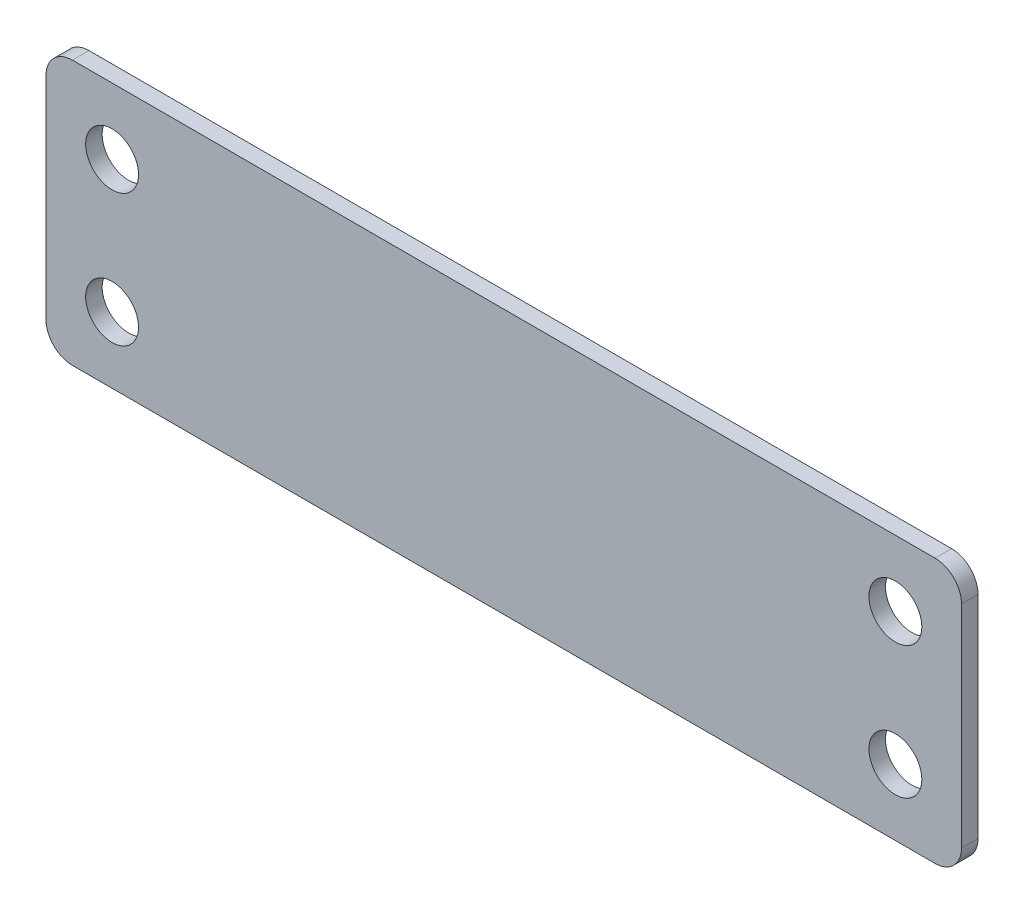
ISO-10303-21;
HEADER;
FILE_DESCRIPTION(('STEP AP214'),'2;1');
FILE_NAME('part.step','',(''),(''),'','','');
FILE_SCHEMA(('AUTOMOTIVE_DESIGN { 1 0 10303 214 1 1 1 1 }'));
ENDSEC;
DATA;
#1=APPLICATION_CONTEXT('core data for automotive mechanical design processes');
#2=APPLICATION_PROTOCOL_DEFINITION('international standard','automotive_design',2000,#1);
#3=PRODUCT_CONTEXT('',#1,'mechanical');
#4=PRODUCT('Part','Part','',(#3));
#5=PRODUCT_RELATED_PRODUCT_CATEGORY('part','',(#4));
#6=PRODUCT_DEFINITION_FORMATION('','',#4);
#7=PRODUCT_DEFINITION_CONTEXT('part definition',#1,'design');
#8=PRODUCT_DEFINITION('design','',#6,#7);
#9=PRODUCT_DEFINITION_SHAPE('','',#8);
#10=(LENGTH_UNIT() NAMED_UNIT(*) SI_UNIT(.MILLI.,.METRE.));
#11=(NAMED_UNIT(*) PLANE_ANGLE_UNIT() SI_UNIT($,.RADIAN.));
#12=(NAMED_UNIT(*) SI_UNIT($,.STERADIAN.) SOLID_ANGLE_UNIT());
#13=UNCERTAINTY_MEASURE_WITH_UNIT(LENGTH_MEASURE(1.E-05),#10,'distance_accuracy_value','');
#14=(GEOMETRIC_REPRESENTATION_CONTEXT(3) GLOBAL_UNCERTAINTY_ASSIGNED_CONTEXT((#13)) GLOBAL_UNIT_ASSIGNED_CONTEXT((#10,
#11,#12)) REPRESENTATION_CONTEXT('',''));
#15=CARTESIAN_POINT('',(0.,0.,0.));
#16=DIRECTION('',(0.,0.,1.));
#17=DIRECTION('',(1.,0.,0.));
#18=AXIS2_PLACEMENT_3D('',#15,#16,#17);
#19=CARTESIAN_POINT('',(0.,0.,1.5875));
#20=DIRECTION('',(-1.,0.,0.));
#21=DIRECTION('',(0.,0.,1.));
#22=AXIS2_PLACEMENT_3D('',#19,#20,#21);
#23=PLANE('',#22);
#24=DIRECTION('',(0.,1.,0.));
#25=VECTOR('',#24,1.);
#26=CARTESIAN_POINT('',(0.,0.,1.5875));
#27=LINE('',#26,#25);
#28=CARTESIAN_POINT('',(0.,2.54,1.5875));
#29=VERTEX_POINT('',#28);
#30=CARTESIAN_POINT('',(0.,22.86,1.5875));
#31=VERTEX_POINT('',#30);
#32=EDGE_CURVE('E129',#29,#31,#27,.T.);
#33=ORIENTED_EDGE('',*,*,#32,.F.);
#34=DIRECTION('',(0.,0.,-1.));
#35=VECTOR('',#34,1.);
#36=CARTESIAN_POINT('',(0.,2.54,1.5875));
#37=LINE('',#36,#35);
#38=CARTESIAN_POINT('',(0.,2.54,0.));
#39=VERTEX_POINT('',#38);
#40=EDGE_CURVE('E155',#29,#39,#37,.T.);
#41=ORIENTED_EDGE('',*,*,#40,.T.);
#42=DIRECTION('',(0.,1.,0.));
#43=VECTOR('',#42,1.);
#44=CARTESIAN_POINT('',(0.,0.,0.));
#45=LINE('',#44,#43);
#46=CARTESIAN_POINT('',(0.,22.86,0.));
#47=VERTEX_POINT('',#46);
#48=EDGE_CURVE('E162',#39,#47,#45,.T.);
#49=ORIENTED_EDGE('',*,*,#48,.T.);
#50=DIRECTION('',(0.,0.,-1.));
#51=VECTOR('',#50,1.);
#52=CARTESIAN_POINT('',(0.,22.86,1.5875));
#53=LINE('',#52,#51);
#54=EDGE_CURVE('E153',#47,#31,#53,.F.);
#55=ORIENTED_EDGE('',*,*,#54,.T.);
#56=EDGE_LOOP('',(#33,#41,#49,#55));
#57=FACE_BOUND('',#56,.T.);
#58=ADVANCED_FACE('F35',(#57),#23,.F.);
#59=CARTESIAN_POINT('',(0.,25.4,1.5875));
#60=DIRECTION('',(0.,-1.,0.));
#61=DIRECTION('',(1.,0.,0.));
#62=AXIS2_PLACEMENT_3D('',#59,#60,#61);
#63=PLANE('',#62);
#64=DIRECTION('',(-1.,0.,0.));
#65=VECTOR('',#64,1.);
#66=CARTESIAN_POINT('',(0.,25.4,1.5875));
#67=LINE('',#66,#65);
#68=CARTESIAN_POINT('',(-2.54,25.4,1.5875));
#69=VERTEX_POINT('',#68);
#70=CARTESIAN_POINT('',(-85.41004,25.4,1.5875));
#71=VERTEX_POINT('',#70);
#72=EDGE_CURVE('E132',#69,#71,#67,.T.);
#73=ORIENTED_EDGE('',*,*,#72,.F.);
#74=DIRECTION('',(0.,0.,-1.));
#75=VECTOR('',#74,1.);
#76=CARTESIAN_POINT('',(-2.54,25.4,1.5875));
#77=LINE('',#76,#75);
#78=CARTESIAN_POINT('',(-2.54,25.4,0.));
#79=VERTEX_POINT('',#78);
#80=EDGE_CURVE('E11',#69,#79,#77,.T.);
#81=ORIENTED_EDGE('',*,*,#80,.T.);
#82=DIRECTION('',(-1.,0.,0.));
#83=VECTOR('',#82,1.);
#84=CARTESIAN_POINT('',(0.,25.4,0.));
#85=LINE('',#84,#83);
#86=CARTESIAN_POINT('',(-85.41004,25.4,0.));
#87=VERTEX_POINT('',#86);
#88=EDGE_CURVE('E134',#79,#87,#85,.T.);
#89=ORIENTED_EDGE('',*,*,#88,.T.);
#90=DIRECTION('',(0.,0.,-1.));
#91=VECTOR('',#90,1.);
#92=CARTESIAN_POINT('',(-85.41004,25.4,1.5875));
#93=LINE('',#92,#91);
#94=EDGE_CURVE('E44',#87,#71,#93,.F.);
#95=ORIENTED_EDGE('',*,*,#94,.T.);
#96=EDGE_LOOP('',(#73,#81,#89,#95));
#97=FACE_BOUND('',#96,.T.);
#98=ADVANCED_FACE('F191',(#97),#63,.F.);
#99=CARTESIAN_POINT('',(-87.95004,0.,1.5875));
#100=DIRECTION('',(1.,0.,0.));
#101=DIRECTION('',(0.,0.,-1.));
#102=AXIS2_PLACEMENT_3D('',#99,#100,#101);
#103=PLANE('',#102);
#104=DIRECTION('',(0.,-1.,0.));
#105=VECTOR('',#104,1.);
#106=CARTESIAN_POINT('',(-87.95004,0.,0.));
#107=LINE('',#106,#105);
#108=CARTESIAN_POINT('',(-87.95004,22.86,0.));
#109=VERTEX_POINT('',#108);
#110=CARTESIAN_POINT('',(-87.95004,2.54,0.));
#111=VERTEX_POINT('',#110);
#112=EDGE_CURVE('E130',#109,#111,#107,.T.);
#113=ORIENTED_EDGE('',*,*,#112,.T.);
#114=DIRECTION('',(0.,0.,-1.));
#115=VECTOR('',#114,1.);
#116=CARTESIAN_POINT('',(-87.95004,2.54,1.5875));
#117=LINE('',#116,#115);
#118=CARTESIAN_POINT('',(-87.95004,2.54,1.5875));
#119=VERTEX_POINT('',#118);
#120=EDGE_CURVE('E108',#111,#119,#117,.F.);
#121=ORIENTED_EDGE('',*,*,#120,.T.);
#122=DIRECTION('',(0.,-1.,0.));
#123=VECTOR('',#122,1.);
#124=CARTESIAN_POINT('',(-87.95004,0.,1.5875));
#125=LINE('',#124,#123);
#126=CARTESIAN_POINT('',(-87.95004,22.86,1.5875));
#127=VERTEX_POINT('',#126);
#128=EDGE_CURVE('E185',#127,#119,#125,.T.);
#129=ORIENTED_EDGE('',*,*,#128,.F.);
#130=DIRECTION('',(0.,0.,-1.));
#131=VECTOR('',#130,1.);
#132=CARTESIAN_POINT('',(-87.95004,22.86,1.5875));
#133=LINE('',#132,#131);
#134=EDGE_CURVE('E113',#127,#109,#133,.T.);
#135=ORIENTED_EDGE('',*,*,#134,.T.);
#136=EDGE_LOOP('',(#113,#121,#129,#135));
#137=FACE_BOUND('',#136,.T.);
#138=ADVANCED_FACE('F199',(#137),#103,.F.);
#139=CARTESIAN_POINT('',(0.,0.,1.5875));
#140=DIRECTION('',(0.,1.,0.));
#141=DIRECTION('',(-1.,0.,0.));
#142=AXIS2_PLACEMENT_3D('',#139,#140,#141);
#143=PLANE('',#142);
#144=DIRECTION('',(1.,0.,0.));
#145=VECTOR('',#144,1.);
#146=CARTESIAN_POINT('',(0.,0.,1.5875));
#147=LINE('',#146,#145);
#148=CARTESIAN_POINT('',(-85.41004,0.,1.5875));
#149=VERTEX_POINT('',#148);
#150=CARTESIAN_POINT('',(-2.54,0.,1.5875));
#151=VERTEX_POINT('',#150);
#152=EDGE_CURVE('E123',#149,#151,#147,.T.);
#153=ORIENTED_EDGE('',*,*,#152,.F.);
#154=DIRECTION('',(0.,0.,-1.));
#155=VECTOR('',#154,1.);
#156=CARTESIAN_POINT('',(-85.41004,0.,1.5875));
#157=LINE('',#156,#155);
#158=CARTESIAN_POINT('',(-85.41004,0.,0.));
#159=VERTEX_POINT('',#158);
#160=EDGE_CURVE('E107',#149,#159,#157,.T.);
#161=ORIENTED_EDGE('',*,*,#160,.T.);
#162=DIRECTION('',(1.,0.,0.));
#163=VECTOR('',#162,1.);
#164=CARTESIAN_POINT('',(0.,0.,0.));
#165=LINE('',#164,#163);
#166=CARTESIAN_POINT('',(-2.54,0.,0.));
#167=VERTEX_POINT('',#166);
#168=EDGE_CURVE('E120',#159,#167,#165,.T.);
#169=ORIENTED_EDGE('',*,*,#168,.T.);
#170=DIRECTION('',(0.,0.,-1.));
#171=VECTOR('',#170,1.);
#172=CARTESIAN_POINT('',(-2.54,0.,1.5875));
#173=LINE('',#172,#171);
#174=EDGE_CURVE('E125',#167,#151,#173,.F.);
#175=ORIENTED_EDGE('',*,*,#174,.T.);
#176=EDGE_LOOP('',(#153,#161,#169,#175));
#177=FACE_BOUND('',#176,.T.);
#178=ADVANCED_FACE('F119',(#177),#143,.F.);
#179=CARTESIAN_POINT('',(0.,0.,1.5875));
#180=DIRECTION('',(0.,0.,1.));
#181=DIRECTION('',(1.,0.,0.));
#182=AXIS2_PLACEMENT_3D('',#179,#180,#181);
#183=PLANE('',#182);
#184=CARTESIAN_POINT('',(-6.35,6.35,1.5875));
#185=DIRECTION('',(0.,0.,1.));
#186=DIRECTION('',(1.,0.,0.));
#187=AXIS2_PLACEMENT_3D('',#184,#185,#186);
#188=CIRCLE('',#187,2.54);
#189=CARTESIAN_POINT('',(-3.81,6.35,1.5875));
#190=VERTEX_POINT('',#189);
#191=EDGE_CURVE('E179',#190,#190,#188,.T.);
#192=ORIENTED_EDGE('',*,*,#191,.F.);
#193=EDGE_LOOP('',(#192));
#194=FACE_BOUND('',#193,.T.);
#195=CARTESIAN_POINT('',(-6.35,19.05,1.5875));
#196=DIRECTION('',(0.,0.,1.));
#197=DIRECTION('',(1.,0.,0.));
#198=AXIS2_PLACEMENT_3D('',#195,#196,#197);
#199=CIRCLE('',#198,2.54);
#200=CARTESIAN_POINT('',(-3.81,19.05,1.5875));
#201=VERTEX_POINT('',#200);
#202=EDGE_CURVE('E169',#201,#201,#199,.T.);
#203=ORIENTED_EDGE('',*,*,#202,.F.);
#204=EDGE_LOOP('',(#203));
#205=FACE_BOUND('',#204,.T.);
#206=CARTESIAN_POINT('',(-81.60004,6.34999999999999,1.5875));
#207=DIRECTION('',(0.,0.,1.));
#208=DIRECTION('',(1.,0.,0.));
#209=AXIS2_PLACEMENT_3D('',#206,#207,#208);
#210=CIRCLE('',#209,2.54);
#211=CARTESIAN_POINT('',(-79.06004,6.34999999999999,1.5875));
#212=VERTEX_POINT('',#211);
#213=EDGE_CURVE('E166',#212,#212,#210,.T.);
#214=ORIENTED_EDGE('',*,*,#213,.F.);
#215=EDGE_LOOP('',(#214));
#216=FACE_BOUND('',#215,.T.);
#217=CARTESIAN_POINT('',(-81.60004,19.05,1.5875));
#218=DIRECTION('',(0.,0.,1.));
#219=DIRECTION('',(1.,0.,0.));
#220=AXIS2_PLACEMENT_3D('',#217,#218,#219);
#221=CIRCLE('',#220,2.54);
#222=CARTESIAN_POINT('',(-79.06004,19.05,1.5875));
#223=VERTEX_POINT('',#222);
#224=EDGE_CURVE('E163',#223,#223,#221,.T.);
#225=ORIENTED_EDGE('',*,*,#224,.F.);
#226=EDGE_LOOP('',(#225));
#227=FACE_BOUND('',#226,.T.);
#228=ORIENTED_EDGE('',*,*,#128,.T.);
#229=CARTESIAN_POINT('',(-85.41004,2.54,1.5875));
#230=DIRECTION('',(0.,0.,1.));
#231=DIRECTION('',(1.,0.,0.));
#232=AXIS2_PLACEMENT_3D('',#229,#230,#231);
#233=CIRCLE('',#232,2.54);
#234=EDGE_CURVE('E151',#119,#149,#233,.T.);
#235=ORIENTED_EDGE('',*,*,#234,.T.);
#236=ORIENTED_EDGE('',*,*,#152,.T.);
#237=CARTESIAN_POINT('',(-2.54,2.54,1.5875));
#238=DIRECTION('',(0.,0.,1.));
#239=DIRECTION('',(1.,0.,0.));
#240=AXIS2_PLACEMENT_3D('',#237,#238,#239);
#241=CIRCLE('',#240,2.54);
#242=EDGE_CURVE('E149',#151,#29,#241,.T.);
#243=ORIENTED_EDGE('',*,*,#242,.T.);
#244=ORIENTED_EDGE('',*,*,#32,.T.);
#245=CARTESIAN_POINT('',(-2.54,22.86,1.5875));
#246=DIRECTION('',(0.,0.,1.));
#247=DIRECTION('',(1.,0.,0.));
#248=AXIS2_PLACEMENT_3D('',#245,#246,#247);
#249=CIRCLE('',#248,2.54);
#250=EDGE_CURVE('E58',#31,#69,#249,.T.);
#251=ORIENTED_EDGE('',*,*,#250,.T.);
#252=ORIENTED_EDGE('',*,*,#72,.T.);
#253=CARTESIAN_POINT('',(-85.41004,22.86,1.5875));
#254=DIRECTION('',(0.,0.,1.));
#255=DIRECTION('',(1.,0.,0.));
#256=AXIS2_PLACEMENT_3D('',#253,#254,#255);
#257=CIRCLE('',#256,2.54);
#258=EDGE_CURVE('E146',#71,#127,#257,.T.);
#259=ORIENTED_EDGE('',*,*,#258,.T.);
#260=EDGE_LOOP('',(#228,#235,#236,#243,#244,#251,#252,#259));
#261=FACE_BOUND('',#260,.T.);
#262=ADVANCED_FACE('F197',(#194,#205,#216,#227,#261),#183,.T.);
#263=CARTESIAN_POINT('',(0.,0.,0.));
#264=DIRECTION('',(0.,0.,1.));
#265=DIRECTION('',(1.,0.,0.));
#266=AXIS2_PLACEMENT_3D('',#263,#264,#265);
#267=PLANE('',#266);
#268=CARTESIAN_POINT('',(-6.35,6.35,0.));
#269=DIRECTION('',(0.,0.,1.));
#270=DIRECTION('',(1.,0.,0.));
#271=AXIS2_PLACEMENT_3D('',#268,#269,#270);
#272=CIRCLE('',#271,2.54);
#273=CARTESIAN_POINT('',(-3.81,6.35,0.));
#274=VERTEX_POINT('',#273);
#275=EDGE_CURVE('E39',#274,#274,#272,.T.);
#276=ORIENTED_EDGE('',*,*,#275,.T.);
#277=EDGE_LOOP('',(#276));
#278=FACE_BOUND('',#277,.T.);
#279=CARTESIAN_POINT('',(-6.35,19.05,0.));
#280=DIRECTION('',(0.,0.,1.));
#281=DIRECTION('',(1.,0.,0.));
#282=AXIS2_PLACEMENT_3D('',#279,#280,#281);
#283=CIRCLE('',#282,2.54);
#284=CARTESIAN_POINT('',(-3.81,19.05,0.));
#285=VERTEX_POINT('',#284);
#286=EDGE_CURVE('E167',#285,#285,#283,.T.);
#287=ORIENTED_EDGE('',*,*,#286,.T.);
#288=EDGE_LOOP('',(#287));
#289=FACE_BOUND('',#288,.T.);
#290=CARTESIAN_POINT('',(-81.60004,6.34999999999999,0.));
#291=DIRECTION('',(0.,0.,1.));
#292=DIRECTION('',(1.,0.,0.));
#293=AXIS2_PLACEMENT_3D('',#290,#291,#292);
#294=CIRCLE('',#293,2.54);
#295=CARTESIAN_POINT('',(-79.06004,6.34999999999999,0.));
#296=VERTEX_POINT('',#295);
#297=EDGE_CURVE('E164',#296,#296,#294,.T.);
#298=ORIENTED_EDGE('',*,*,#297,.T.);
#299=EDGE_LOOP('',(#298));
#300=FACE_BOUND('',#299,.T.);
#301=CARTESIAN_POINT('',(-81.60004,19.05,0.));
#302=DIRECTION('',(0.,0.,1.));
#303=DIRECTION('',(1.,0.,0.));
#304=AXIS2_PLACEMENT_3D('',#301,#302,#303);
#305=CIRCLE('',#304,2.54);
#306=CARTESIAN_POINT('',(-79.06004,19.05,0.));
#307=VERTEX_POINT('',#306);
#308=EDGE_CURVE('E159',#307,#307,#305,.T.);
#309=ORIENTED_EDGE('',*,*,#308,.T.);
#310=EDGE_LOOP('',(#309));
#311=FACE_BOUND('',#310,.T.);
#312=ORIENTED_EDGE('',*,*,#168,.F.);
#313=CARTESIAN_POINT('',(-85.41004,2.54,0.));
#314=DIRECTION('',(0.,0.,1.));
#315=DIRECTION('',(1.,0.,0.));
#316=AXIS2_PLACEMENT_3D('',#313,#314,#315);
#317=CIRCLE('',#316,2.54);
#318=EDGE_CURVE('E103',#159,#111,#317,.F.);
#319=ORIENTED_EDGE('',*,*,#318,.T.);
#320=ORIENTED_EDGE('',*,*,#112,.F.);
#321=CARTESIAN_POINT('',(-85.41004,22.86,0.));
#322=DIRECTION('',(0.,0.,1.));
#323=DIRECTION('',(1.,0.,0.));
#324=AXIS2_PLACEMENT_3D('',#321,#322,#323);
#325=CIRCLE('',#324,2.54);
#326=EDGE_CURVE('E124',#109,#87,#325,.F.);
#327=ORIENTED_EDGE('',*,*,#326,.T.);
#328=ORIENTED_EDGE('',*,*,#88,.F.);
#329=CARTESIAN_POINT('',(-2.54,22.86,0.));
#330=DIRECTION('',(0.,0.,1.));
#331=DIRECTION('',(1.,0.,0.));
#332=AXIS2_PLACEMENT_3D('',#329,#330,#331);
#333=CIRCLE('',#332,2.54);
#334=EDGE_CURVE('E140',#79,#47,#333,.F.);
#335=ORIENTED_EDGE('',*,*,#334,.T.);
#336=ORIENTED_EDGE('',*,*,#48,.F.);
#337=CARTESIAN_POINT('',(-2.54,2.54,0.));
#338=DIRECTION('',(0.,0.,1.));
#339=DIRECTION('',(1.,0.,0.));
#340=AXIS2_PLACEMENT_3D('',#337,#338,#339);
#341=CIRCLE('',#340,2.54);
#342=EDGE_CURVE('E114',#39,#167,#341,.F.);
#343=ORIENTED_EDGE('',*,*,#342,.T.);
#344=EDGE_LOOP('',(#312,#319,#320,#327,#328,#335,#336,#343));
#345=FACE_BOUND('',#344,.T.);
#346=ADVANCED_FACE('F127',(#278,#289,#300,#311,#345),#267,.F.);
#347=CARTESIAN_POINT('',(-85.41004,2.54,1.5875));
#348=DIRECTION('',(0.,0.,-1.));
#349=DIRECTION('',(-1.,0.,0.));
#350=AXIS2_PLACEMENT_3D('',#347,#348,#349);
#351=CYLINDRICAL_SURFACE('',#350,2.54);
#352=ORIENTED_EDGE('',*,*,#234,.F.);
#353=ORIENTED_EDGE('',*,*,#120,.F.);
#354=ORIENTED_EDGE('',*,*,#318,.F.);
#355=ORIENTED_EDGE('',*,*,#160,.F.);
#356=EDGE_LOOP('',(#352,#353,#354,#355));
#357=FACE_BOUND('',#356,.T.);
#358=ADVANCED_FACE('F106',(#357),#351,.T.);
#359=CARTESIAN_POINT('',(-2.54,2.54,1.5875));
#360=DIRECTION('',(0.,0.,-1.));
#361=DIRECTION('',(-1.,0.,0.));
#362=AXIS2_PLACEMENT_3D('',#359,#360,#361);
#363=CYLINDRICAL_SURFACE('',#362,2.54);
#364=ORIENTED_EDGE('',*,*,#242,.F.);
#365=ORIENTED_EDGE('',*,*,#174,.F.);
#366=ORIENTED_EDGE('',*,*,#342,.F.);
#367=ORIENTED_EDGE('',*,*,#40,.F.);
#368=EDGE_LOOP('',(#364,#365,#366,#367));
#369=FACE_BOUND('',#368,.T.);
#370=ADVANCED_FACE('F217',(#369),#363,.T.);
#371=CARTESIAN_POINT('',(-2.54,22.86,1.5875));
#372=DIRECTION('',(0.,0.,-1.));
#373=DIRECTION('',(-1.,0.,0.));
#374=AXIS2_PLACEMENT_3D('',#371,#372,#373);
#375=CYLINDRICAL_SURFACE('',#374,2.54);
#376=ORIENTED_EDGE('',*,*,#250,.F.);
#377=ORIENTED_EDGE('',*,*,#54,.F.);
#378=ORIENTED_EDGE('',*,*,#334,.F.);
#379=ORIENTED_EDGE('',*,*,#80,.F.);
#380=EDGE_LOOP('',(#376,#377,#378,#379));
#381=FACE_BOUND('',#380,.T.);
#382=ADVANCED_FACE('F219',(#381),#375,.T.);
#383=CARTESIAN_POINT('',(-85.41004,22.86,1.5875));
#384=DIRECTION('',(0.,0.,-1.));
#385=DIRECTION('',(-1.,0.,0.));
#386=AXIS2_PLACEMENT_3D('',#383,#384,#385);
#387=CYLINDRICAL_SURFACE('',#386,2.54);
#388=ORIENTED_EDGE('',*,*,#258,.F.);
#389=ORIENTED_EDGE('',*,*,#94,.F.);
#390=ORIENTED_EDGE('',*,*,#326,.F.);
#391=ORIENTED_EDGE('',*,*,#134,.F.);
#392=EDGE_LOOP('',(#388,#389,#390,#391));
#393=FACE_BOUND('',#392,.T.);
#394=ADVANCED_FACE('F37',(#393),#387,.T.);
#395=CARTESIAN_POINT('',(-81.60004,19.05,-0.9525));
#396=DIRECTION('',(0.,0.,1.));
#397=DIRECTION('',(1.,0.,0.));
#398=AXIS2_PLACEMENT_3D('',#395,#396,#397);
#399=CYLINDRICAL_SURFACE('',#398,2.54);
#400=ORIENTED_EDGE('',*,*,#224,.T.);
#401=EDGE_LOOP('',(#400));
#402=FACE_BOUND('',#401,.T.);
#403=ORIENTED_EDGE('',*,*,#308,.F.);
#404=EDGE_LOOP('',(#403));
#405=FACE_BOUND('',#404,.T.);
#406=ADVANCED_FACE('F226',(#402,#405),#399,.F.);
#407=CARTESIAN_POINT('',(-81.60004,6.34999999999999,-0.9525));
#408=DIRECTION('',(0.,0.,1.));
#409=DIRECTION('',(1.,0.,0.));
#410=AXIS2_PLACEMENT_3D('',#407,#408,#409);
#411=CYLINDRICAL_SURFACE('',#410,2.54);
#412=ORIENTED_EDGE('',*,*,#213,.T.);
#413=EDGE_LOOP('',(#412));
#414=FACE_BOUND('',#413,.T.);
#415=ORIENTED_EDGE('',*,*,#297,.F.);
#416=EDGE_LOOP('',(#415));
#417=FACE_BOUND('',#416,.T.);
#418=ADVANCED_FACE('F233',(#414,#417),#411,.F.);
#419=CARTESIAN_POINT('',(-6.35,19.05,-0.9525));
#420=DIRECTION('',(0.,0.,1.));
#421=DIRECTION('',(1.,0.,0.));
#422=AXIS2_PLACEMENT_3D('',#419,#420,#421);
#423=CYLINDRICAL_SURFACE('',#422,2.54);
#424=ORIENTED_EDGE('',*,*,#202,.T.);
#425=EDGE_LOOP('',(#424));
#426=FACE_BOUND('',#425,.T.);
#427=ORIENTED_EDGE('',*,*,#286,.F.);
#428=EDGE_LOOP('',(#427));
#429=FACE_BOUND('',#428,.T.);
#430=ADVANCED_FACE('F239',(#426,#429),#423,.F.);
#431=CARTESIAN_POINT('',(-6.35,6.35,-0.9525));
#432=DIRECTION('',(0.,0.,1.));
#433=DIRECTION('',(1.,0.,0.));
#434=AXIS2_PLACEMENT_3D('',#431,#432,#433);
#435=CYLINDRICAL_SURFACE('',#434,2.54);
#436=ORIENTED_EDGE('',*,*,#191,.T.);
#437=EDGE_LOOP('',(#436));
#438=FACE_BOUND('',#437,.T.);
#439=ORIENTED_EDGE('',*,*,#275,.F.);
#440=EDGE_LOOP('',(#439));
#441=FACE_BOUND('',#440,.T.);
#442=ADVANCED_FACE('F259',(#438,#441),#435,.F.);
#443=CLOSED_SHELL('',(#58,#98,#138,#178,#262,#346,#358,#370,#382,#394,#406,#418,#430,#442));
#444=MANIFOLD_SOLID_BREP('B2',#443);
#445=ADVANCED_BREP_SHAPE_REPRESENTATION('',(#18,#444),#14);
#446=SHAPE_DEFINITION_REPRESENTATION(#9,#445);
ENDSEC;
END-ISO-10303-21;
